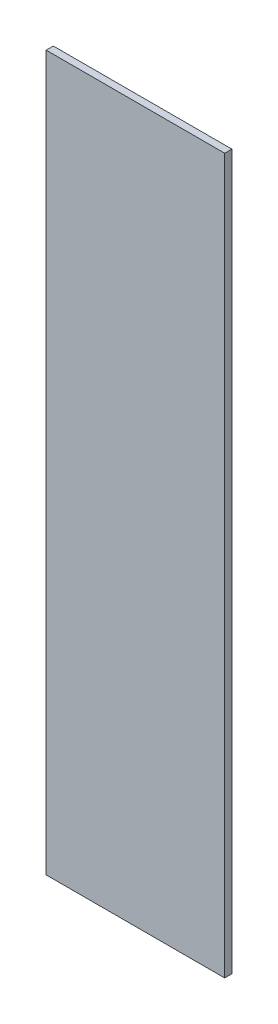
ISO-10303-21;
HEADER;
FILE_DESCRIPTION(('STEP AP214'),'2;1');
FILE_NAME('part.step','',(''),(''),'','','');
FILE_SCHEMA(('AUTOMOTIVE_DESIGN { 1 0 10303 214 1 1 1 1 }'));
ENDSEC;
DATA;
#1=APPLICATION_CONTEXT('core data for automotive mechanical design processes');
#2=APPLICATION_PROTOCOL_DEFINITION('international standard','automotive_design',2000,#1);
#3=PRODUCT_CONTEXT('',#1,'mechanical');
#4=PRODUCT('Part','Part','',(#3));
#5=PRODUCT_RELATED_PRODUCT_CATEGORY('part','',(#4));
#6=PRODUCT_DEFINITION_FORMATION('','',#4);
#7=PRODUCT_DEFINITION_CONTEXT('part definition',#1,'design');
#8=PRODUCT_DEFINITION('design','',#6,#7);
#9=PRODUCT_DEFINITION_SHAPE('','',#8);
#10=(LENGTH_UNIT() NAMED_UNIT(*) SI_UNIT(.MILLI.,.METRE.));
#11=(NAMED_UNIT(*) PLANE_ANGLE_UNIT() SI_UNIT($,.RADIAN.));
#12=(NAMED_UNIT(*) SI_UNIT($,.STERADIAN.) SOLID_ANGLE_UNIT());
#13=UNCERTAINTY_MEASURE_WITH_UNIT(LENGTH_MEASURE(1.E-05),#10,'distance_accuracy_value','');
#14=(GEOMETRIC_REPRESENTATION_CONTEXT(3) GLOBAL_UNCERTAINTY_ASSIGNED_CONTEXT((#13)) GLOBAL_UNIT_ASSIGNED_CONTEXT((#10,
#11,#12)) REPRESENTATION_CONTEXT('',''));
#15=CARTESIAN_POINT('',(0.,0.,0.));
#16=DIRECTION('',(0.,0.,1.));
#17=DIRECTION('',(1.,0.,0.));
#18=AXIS2_PLACEMENT_3D('',#15,#16,#17);
#19=CARTESIAN_POINT('',(-25.,200.,1.));
#20=DIRECTION('',(1.,0.,0.));
#21=DIRECTION('',(0.,0.,-1.));
#22=AXIS2_PLACEMENT_3D('',#19,#20,#21);
#23=PLANE('',#22);
#24=DIRECTION('',(0.,0.,1.));
#25=VECTOR('',#24,1.);
#26=CARTESIAN_POINT('',(-25.,0.,1.));
#27=LINE('',#26,#25);
#28=CARTESIAN_POINT('',(-25.,0.,-0.999999999999997));
#29=VERTEX_POINT('',#28);
#30=CARTESIAN_POINT('',(-25.,0.,1.));
#31=VERTEX_POINT('',#30);
#32=EDGE_CURVE('E96',#29,#31,#27,.T.);
#33=ORIENTED_EDGE('',*,*,#32,.T.);
#34=DIRECTION('',(0.,-1.,0.));
#35=VECTOR('',#34,1.);
#36=CARTESIAN_POINT('',(-25.,200.,1.));
#37=LINE('',#36,#35);
#38=CARTESIAN_POINT('',(-25.,200.,1.));
#39=VERTEX_POINT('',#38);
#40=EDGE_CURVE('E11',#39,#31,#37,.T.);
#41=ORIENTED_EDGE('',*,*,#40,.F.);
#42=DIRECTION('',(0.,0.,1.));
#43=VECTOR('',#42,1.);
#44=CARTESIAN_POINT('',(-25.,200.,1.));
#45=LINE('',#44,#43);
#46=CARTESIAN_POINT('',(-25.,200.,-0.999999999999997));
#47=VERTEX_POINT('',#46);
#48=EDGE_CURVE('E84',#47,#39,#45,.T.);
#49=ORIENTED_EDGE('',*,*,#48,.F.);
#50=DIRECTION('',(0.,-1.,0.));
#51=VECTOR('',#50,1.);
#52=CARTESIAN_POINT('',(-25.,200.,-0.999999999999997));
#53=LINE('',#52,#51);
#54=EDGE_CURVE('E92',#47,#29,#53,.T.);
#55=ORIENTED_EDGE('',*,*,#54,.T.);
#56=EDGE_LOOP('',(#33,#41,#49,#55));
#57=FACE_BOUND('',#56,.T.);
#58=ADVANCED_FACE('F33',(#57),#23,.F.);
#59=CARTESIAN_POINT('',(25.,200.,0.999999999999996));
#60=DIRECTION('',(0.,0.,-1.));
#61=DIRECTION('',(-1.,0.,0.));
#62=AXIS2_PLACEMENT_3D('',#59,#60,#61);
#63=PLANE('',#62);
#64=DIRECTION('',(1.,0.,0.));
#65=VECTOR('',#64,1.);
#66=CARTESIAN_POINT('',(25.,0.,0.999999999999996));
#67=LINE('',#66,#65);
#68=CARTESIAN_POINT('',(25.,0.,0.999999999999996));
#69=VERTEX_POINT('',#68);
#70=EDGE_CURVE('E88',#31,#69,#67,.T.);
#71=ORIENTED_EDGE('',*,*,#70,.T.);
#72=DIRECTION('',(0.,-1.,0.));
#73=VECTOR('',#72,1.);
#74=CARTESIAN_POINT('',(25.,200.,0.999999999999996));
#75=LINE('',#74,#73);
#76=CARTESIAN_POINT('',(25.,200.,0.999999999999996));
#77=VERTEX_POINT('',#76);
#78=EDGE_CURVE('E41',#77,#69,#75,.T.);
#79=ORIENTED_EDGE('',*,*,#78,.F.);
#80=DIRECTION('',(1.,0.,0.));
#81=VECTOR('',#80,1.);
#82=CARTESIAN_POINT('',(25.,200.,0.999999999999996));
#83=LINE('',#82,#81);
#84=EDGE_CURVE('E79',#39,#77,#83,.T.);
#85=ORIENTED_EDGE('',*,*,#84,.F.);
#86=ORIENTED_EDGE('',*,*,#40,.T.);
#87=EDGE_LOOP('',(#71,#79,#85,#86));
#88=FACE_BOUND('',#87,.T.);
#89=ADVANCED_FACE('F87',(#88),#63,.F.);
#90=CARTESIAN_POINT('',(25.,200.,0.999999999999996));
#91=DIRECTION('',(-1.,0.,0.));
#92=DIRECTION('',(0.,0.,1.));
#93=AXIS2_PLACEMENT_3D('',#90,#91,#92);
#94=PLANE('',#93);
#95=DIRECTION('',(0.,0.,-1.));
#96=VECTOR('',#95,1.);
#97=CARTESIAN_POINT('',(25.,0.,0.999999999999996));
#98=LINE('',#97,#96);
#99=CARTESIAN_POINT('',(25.,0.,-1.));
#100=VERTEX_POINT('',#99);
#101=EDGE_CURVE('E66',#69,#100,#98,.T.);
#102=ORIENTED_EDGE('',*,*,#101,.T.);
#103=DIRECTION('',(0.,-1.,0.));
#104=VECTOR('',#103,1.);
#105=CARTESIAN_POINT('',(25.,200.,-1.));
#106=LINE('',#105,#104);
#107=CARTESIAN_POINT('',(25.,200.,-1.));
#108=VERTEX_POINT('',#107);
#109=EDGE_CURVE('E89',#108,#100,#106,.T.);
#110=ORIENTED_EDGE('',*,*,#109,.F.);
#111=DIRECTION('',(0.,0.,-1.));
#112=VECTOR('',#111,1.);
#113=CARTESIAN_POINT('',(25.,200.,0.999999999999996));
#114=LINE('',#113,#112);
#115=EDGE_CURVE('E82',#77,#108,#114,.T.);
#116=ORIENTED_EDGE('',*,*,#115,.F.);
#117=ORIENTED_EDGE('',*,*,#78,.T.);
#118=EDGE_LOOP('',(#102,#110,#116,#117));
#119=FACE_BOUND('',#118,.T.);
#120=ADVANCED_FACE('F90',(#119),#94,.F.);
#121=CARTESIAN_POINT('',(25.,200.,-1.));
#122=DIRECTION('',(0.,0.,1.));
#123=DIRECTION('',(1.,0.,0.));
#124=AXIS2_PLACEMENT_3D('',#121,#122,#123);
#125=PLANE('',#124);
#126=DIRECTION('',(-1.,0.,0.));
#127=VECTOR('',#126,1.);
#128=CARTESIAN_POINT('',(25.,0.,-1.));
#129=LINE('',#128,#127);
#130=EDGE_CURVE('E72',#100,#29,#129,.T.);
#131=ORIENTED_EDGE('',*,*,#130,.T.);
#132=ORIENTED_EDGE('',*,*,#54,.F.);
#133=DIRECTION('',(-1.,0.,0.));
#134=VECTOR('',#133,1.);
#135=CARTESIAN_POINT('',(25.,200.,-1.));
#136=LINE('',#135,#134);
#137=EDGE_CURVE('E49',#108,#47,#136,.T.);
#138=ORIENTED_EDGE('',*,*,#137,.F.);
#139=ORIENTED_EDGE('',*,*,#109,.T.);
#140=EDGE_LOOP('',(#131,#132,#138,#139));
#141=FACE_BOUND('',#140,.T.);
#142=ADVANCED_FACE('F103',(#141),#125,.F.);
#143=CARTESIAN_POINT('',(0.,200.,0.));
#144=DIRECTION('',(0.,1.,0.));
#145=DIRECTION('',(0.,0.,1.));
#146=AXIS2_PLACEMENT_3D('',#143,#144,#145);
#147=PLANE('',#146);
#148=ORIENTED_EDGE('',*,*,#48,.T.);
#149=ORIENTED_EDGE('',*,*,#84,.T.);
#150=ORIENTED_EDGE('',*,*,#115,.T.);
#151=ORIENTED_EDGE('',*,*,#137,.T.);
#152=EDGE_LOOP('',(#148,#149,#150,#151));
#153=FACE_BOUND('',#152,.T.);
#154=ADVANCED_FACE('F80',(#153),#147,.T.);
#155=CARTESIAN_POINT('',(0.,0.,0.));
#156=DIRECTION('',(0.,1.,0.));
#157=DIRECTION('',(0.,0.,1.));
#158=AXIS2_PLACEMENT_3D('',#155,#156,#157);
#159=PLANE('',#158);
#160=ORIENTED_EDGE('',*,*,#32,.F.);
#161=ORIENTED_EDGE('',*,*,#130,.F.);
#162=ORIENTED_EDGE('',*,*,#101,.F.);
#163=ORIENTED_EDGE('',*,*,#70,.F.);
#164=EDGE_LOOP('',(#160,#161,#162,#163));
#165=FACE_BOUND('',#164,.T.);
#166=ADVANCED_FACE('F106',(#165),#159,.F.);
#167=CLOSED_SHELL('',(#58,#89,#120,#142,#154,#166));
#168=MANIFOLD_SOLID_BREP('B2',#167);
#169=ADVANCED_BREP_SHAPE_REPRESENTATION('',(#18,#168),#14);
#170=SHAPE_DEFINITION_REPRESENTATION(#9,#169);
ENDSEC;
END-ISO-10303-21;
